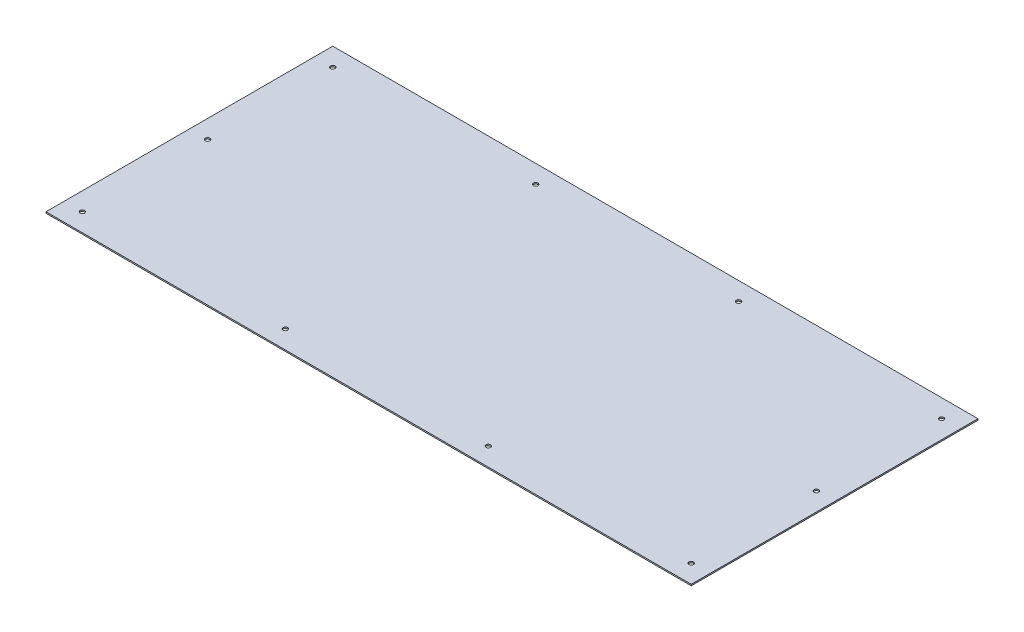
ISO-10303-21;
HEADER;
FILE_DESCRIPTION(('STEP AP214'),'2;1');
FILE_NAME('part.step','',(''),(''),'','','');
FILE_SCHEMA(('AUTOMOTIVE_DESIGN { 1 0 10303 214 1 1 1 1 }'));
ENDSEC;
DATA;
#1=APPLICATION_CONTEXT('core data for automotive mechanical design processes');
#2=APPLICATION_PROTOCOL_DEFINITION('international standard','automotive_design',2000,#1);
#3=PRODUCT_CONTEXT('',#1,'mechanical');
#4=PRODUCT('Part','Part','',(#3));
#5=PRODUCT_RELATED_PRODUCT_CATEGORY('part','',(#4));
#6=PRODUCT_DEFINITION_FORMATION('','',#4);
#7=PRODUCT_DEFINITION_CONTEXT('part definition',#1,'design');
#8=PRODUCT_DEFINITION('design','',#6,#7);
#9=PRODUCT_DEFINITION_SHAPE('','',#8);
#10=(LENGTH_UNIT() NAMED_UNIT(*) SI_UNIT(.MILLI.,.METRE.));
#11=(NAMED_UNIT(*) PLANE_ANGLE_UNIT() SI_UNIT($,.RADIAN.));
#12=(NAMED_UNIT(*) SI_UNIT($,.STERADIAN.) SOLID_ANGLE_UNIT());
#13=UNCERTAINTY_MEASURE_WITH_UNIT(LENGTH_MEASURE(1.E-05),#10,'distance_accuracy_value','');
#14=(GEOMETRIC_REPRESENTATION_CONTEXT(3) GLOBAL_UNCERTAINTY_ASSIGNED_CONTEXT((#13)) GLOBAL_UNIT_ASSIGNED_CONTEXT((#10,
#11,#12)) REPRESENTATION_CONTEXT('',''));
#15=CARTESIAN_POINT('',(0.,0.,0.));
#16=DIRECTION('',(0.,0.,1.));
#17=DIRECTION('',(1.,0.,0.));
#18=AXIS2_PLACEMENT_3D('',#15,#16,#17);
#19=CARTESIAN_POINT('',(450.,1.9,-200.));
#20=DIRECTION('',(-1.,0.,0.));
#21=DIRECTION('',(0.,0.,1.));
#22=AXIS2_PLACEMENT_3D('',#19,#20,#21);
#23=PLANE('',#22);
#24=DIRECTION('',(0.,0.,-1.));
#25=VECTOR('',#24,1.);
#26=CARTESIAN_POINT('',(450.,0.,-200.));
#27=LINE('',#26,#25);
#28=CARTESIAN_POINT('',(450.,0.,200.));
#29=VERTEX_POINT('',#28);
#30=CARTESIAN_POINT('',(450.,0.,-200.));
#31=VERTEX_POINT('',#30);
#32=EDGE_CURVE('E104',#29,#31,#27,.T.);
#33=ORIENTED_EDGE('',*,*,#32,.T.);
#34=DIRECTION('',(0.,-1.,0.));
#35=VECTOR('',#34,1.);
#36=CARTESIAN_POINT('',(450.,1.9,-200.));
#37=LINE('',#36,#35);
#38=CARTESIAN_POINT('',(450.,1.9,-200.));
#39=VERTEX_POINT('',#38);
#40=EDGE_CURVE('E11',#39,#31,#37,.T.);
#41=ORIENTED_EDGE('',*,*,#40,.F.);
#42=DIRECTION('',(0.,0.,-1.));
#43=VECTOR('',#42,1.);
#44=CARTESIAN_POINT('',(450.,1.9,-200.));
#45=LINE('',#44,#43);
#46=CARTESIAN_POINT('',(450.,1.9,200.));
#47=VERTEX_POINT('',#46);
#48=EDGE_CURVE('E91',#47,#39,#45,.T.);
#49=ORIENTED_EDGE('',*,*,#48,.F.);
#50=DIRECTION('',(0.,-1.,0.));
#51=VECTOR('',#50,1.);
#52=CARTESIAN_POINT('',(450.,1.9,200.));
#53=LINE('',#52,#51);
#54=EDGE_CURVE('E100',#47,#29,#53,.T.);
#55=ORIENTED_EDGE('',*,*,#54,.T.);
#56=EDGE_LOOP('',(#33,#41,#49,#55));
#57=FACE_BOUND('',#56,.T.);
#58=ADVANCED_FACE('F38',(#57),#23,.F.);
#59=CARTESIAN_POINT('',(-450.,1.9,-200.));
#60=DIRECTION('',(0.,0.,1.));
#61=DIRECTION('',(1.,0.,0.));
#62=AXIS2_PLACEMENT_3D('',#59,#60,#61);
#63=PLANE('',#62);
#64=DIRECTION('',(-1.,0.,0.));
#65=VECTOR('',#64,1.);
#66=CARTESIAN_POINT('',(-450.,0.,-200.));
#67=LINE('',#66,#65);
#68=CARTESIAN_POINT('',(-450.,0.,-200.));
#69=VERTEX_POINT('',#68);
#70=EDGE_CURVE('E95',#31,#69,#67,.T.);
#71=ORIENTED_EDGE('',*,*,#70,.T.);
#72=DIRECTION('',(0.,-1.,0.));
#73=VECTOR('',#72,1.);
#74=CARTESIAN_POINT('',(-450.,1.9,-200.));
#75=LINE('',#74,#73);
#76=CARTESIAN_POINT('',(-450.,1.9,-200.));
#77=VERTEX_POINT('',#76);
#78=EDGE_CURVE('E47',#77,#69,#75,.T.);
#79=ORIENTED_EDGE('',*,*,#78,.F.);
#80=DIRECTION('',(-1.,0.,0.));
#81=VECTOR('',#80,1.);
#82=CARTESIAN_POINT('',(-450.,1.9,-200.));
#83=LINE('',#82,#81);
#84=EDGE_CURVE('E86',#39,#77,#83,.T.);
#85=ORIENTED_EDGE('',*,*,#84,.F.);
#86=ORIENTED_EDGE('',*,*,#40,.T.);
#87=EDGE_LOOP('',(#71,#79,#85,#86));
#88=FACE_BOUND('',#87,.T.);
#89=ADVANCED_FACE('F94',(#88),#63,.F.);
#90=CARTESIAN_POINT('',(-450.,1.9,-200.));
#91=DIRECTION('',(1.,0.,0.));
#92=DIRECTION('',(0.,0.,-1.));
#93=AXIS2_PLACEMENT_3D('',#90,#91,#92);
#94=PLANE('',#93);
#95=DIRECTION('',(0.,0.,1.));
#96=VECTOR('',#95,1.);
#97=CARTESIAN_POINT('',(-450.,0.,-200.));
#98=LINE('',#97,#96);
#99=CARTESIAN_POINT('',(-450.,0.,200.));
#100=VERTEX_POINT('',#99);
#101=EDGE_CURVE('E73',#69,#100,#98,.T.);
#102=ORIENTED_EDGE('',*,*,#101,.T.);
#103=DIRECTION('',(0.,-1.,0.));
#104=VECTOR('',#103,1.);
#105=CARTESIAN_POINT('',(-450.,1.9,200.));
#106=LINE('',#105,#104);
#107=CARTESIAN_POINT('',(-450.,1.9,200.));
#108=VERTEX_POINT('',#107);
#109=EDGE_CURVE('E96',#108,#100,#106,.T.);
#110=ORIENTED_EDGE('',*,*,#109,.F.);
#111=DIRECTION('',(0.,0.,1.));
#112=VECTOR('',#111,1.);
#113=CARTESIAN_POINT('',(-450.,1.9,-200.));
#114=LINE('',#113,#112);
#115=EDGE_CURVE('E89',#77,#108,#114,.T.);
#116=ORIENTED_EDGE('',*,*,#115,.F.);
#117=ORIENTED_EDGE('',*,*,#78,.T.);
#118=EDGE_LOOP('',(#102,#110,#116,#117));
#119=FACE_BOUND('',#118,.T.);
#120=ADVANCED_FACE('F98',(#119),#94,.F.);
#121=CARTESIAN_POINT('',(-450.,1.9,200.));
#122=DIRECTION('',(0.,0.,-1.));
#123=DIRECTION('',(-1.,0.,0.));
#124=AXIS2_PLACEMENT_3D('',#121,#122,#123);
#125=PLANE('',#124);
#126=DIRECTION('',(1.,0.,0.));
#127=VECTOR('',#126,1.);
#128=CARTESIAN_POINT('',(-450.,0.,200.));
#129=LINE('',#128,#127);
#130=EDGE_CURVE('E79',#100,#29,#129,.T.);
#131=ORIENTED_EDGE('',*,*,#130,.T.);
#132=ORIENTED_EDGE('',*,*,#54,.F.);
#133=DIRECTION('',(1.,0.,0.));
#134=VECTOR('',#133,1.);
#135=CARTESIAN_POINT('',(-450.,1.9,200.));
#136=LINE('',#135,#134);
#137=EDGE_CURVE('E56',#108,#47,#136,.T.);
#138=ORIENTED_EDGE('',*,*,#137,.F.);
#139=ORIENTED_EDGE('',*,*,#109,.T.);
#140=EDGE_LOOP('',(#131,#132,#138,#139));
#141=FACE_BOUND('',#140,.T.);
#142=ADVANCED_FACE('F182',(#141),#125,.F.);
#143=CARTESIAN_POINT('',(0.,1.9,0.));
#144=DIRECTION('',(0.,1.,0.));
#145=DIRECTION('',(0.,0.,1.));
#146=AXIS2_PLACEMENT_3D('',#143,#144,#145);
#147=PLANE('',#146);
#148=CARTESIAN_POINT('',(424.6,1.9,174.6));
#149=DIRECTION('',(0.,1.,0.));
#150=DIRECTION('',(0.,0.,-1.));
#151=AXIS2_PLACEMENT_3D('',#148,#149,#150);
#152=CIRCLE('',#151,3.17499999999997);
#153=CARTESIAN_POINT('',(424.6,1.9,171.425));
#154=VERTEX_POINT('',#153);
#155=EDGE_CURVE('E153',#154,#154,#152,.T.);
#156=ORIENTED_EDGE('',*,*,#155,.F.);
#157=EDGE_LOOP('',(#156));
#158=FACE_BOUND('',#157,.T.);
#159=CARTESIAN_POINT('',(-141.54,1.9,174.6));
#160=DIRECTION('',(0.,1.,0.));
#161=DIRECTION('',(0.,0.,1.));
#162=AXIS2_PLACEMENT_3D('',#159,#160,#161);
#163=CIRCLE('',#162,3.17499999999997);
#164=CARTESIAN_POINT('',(-141.54,1.9,177.775));
#165=VERTEX_POINT('',#164);
#166=EDGE_CURVE('E161',#165,#165,#163,.T.);
#167=ORIENTED_EDGE('',*,*,#166,.F.);
#168=EDGE_LOOP('',(#167));
#169=FACE_BOUND('',#168,.T.);
#170=CARTESIAN_POINT('',(141.52,1.9,174.6));
#171=DIRECTION('',(0.,1.,0.));
#172=DIRECTION('',(0.,0.,1.));
#173=AXIS2_PLACEMENT_3D('',#170,#171,#172);
#174=CIRCLE('',#173,3.17499999999997);
#175=CARTESIAN_POINT('',(141.52,1.9,177.775));
#176=VERTEX_POINT('',#175);
#177=EDGE_CURVE('E164',#176,#176,#174,.T.);
#178=ORIENTED_EDGE('',*,*,#177,.F.);
#179=EDGE_LOOP('',(#178));
#180=FACE_BOUND('',#179,.T.);
#181=CARTESIAN_POINT('',(141.52,1.9,-174.6));
#182=DIRECTION('',(0.,1.,0.));
#183=DIRECTION('',(0.,0.,-1.));
#184=AXIS2_PLACEMENT_3D('',#181,#182,#183);
#185=CIRCLE('',#184,3.17499999999997);
#186=CARTESIAN_POINT('',(141.52,1.9,-177.775));
#187=VERTEX_POINT('',#186);
#188=EDGE_CURVE('E170',#187,#187,#185,.T.);
#189=ORIENTED_EDGE('',*,*,#188,.F.);
#190=EDGE_LOOP('',(#189));
#191=FACE_BOUND('',#190,.T.);
#192=CARTESIAN_POINT('',(-141.54,1.9,-174.6));
#193=DIRECTION('',(0.,1.,0.));
#194=DIRECTION('',(0.,0.,-1.));
#195=AXIS2_PLACEMENT_3D('',#192,#193,#194);
#196=CIRCLE('',#195,3.17499999999997);
#197=CARTESIAN_POINT('',(-141.54,1.9,-177.775));
#198=VERTEX_POINT('',#197);
#199=EDGE_CURVE('E167',#198,#198,#196,.T.);
#200=ORIENTED_EDGE('',*,*,#199,.F.);
#201=EDGE_LOOP('',(#200));
#202=FACE_BOUND('',#201,.T.);
#203=CARTESIAN_POINT('',(424.6,1.9,0.));
#204=DIRECTION('',(0.,1.,0.));
#205=DIRECTION('',(0.,0.,-1.));
#206=AXIS2_PLACEMENT_3D('',#203,#204,#205);
#207=CIRCLE('',#206,3.17499999999997);
#208=CARTESIAN_POINT('',(424.6,1.9,-3.17499999999997));
#209=VERTEX_POINT('',#208);
#210=EDGE_CURVE('E149',#209,#209,#207,.T.);
#211=ORIENTED_EDGE('',*,*,#210,.F.);
#212=EDGE_LOOP('',(#211));
#213=FACE_BOUND('',#212,.T.);
#214=CARTESIAN_POINT('',(424.6,1.9,-174.6));
#215=DIRECTION('',(0.,1.,0.));
#216=DIRECTION('',(0.,0.,-1.));
#217=AXIS2_PLACEMENT_3D('',#214,#215,#216);
#218=CIRCLE('',#217,3.17499999999997);
#219=CARTESIAN_POINT('',(424.6,1.9,-177.775));
#220=VERTEX_POINT('',#219);
#221=EDGE_CURVE('E152',#220,#220,#218,.T.);
#222=ORIENTED_EDGE('',*,*,#221,.F.);
#223=EDGE_LOOP('',(#222));
#224=FACE_BOUND('',#223,.T.);
#225=CARTESIAN_POINT('',(-424.6,1.9,0.));
#226=DIRECTION('',(0.,1.,0.));
#227=DIRECTION('',(0.,0.,1.));
#228=AXIS2_PLACEMENT_3D('',#225,#226,#227);
#229=CIRCLE('',#228,3.17499999999997);
#230=CARTESIAN_POINT('',(-424.6,1.9,3.17499999999997));
#231=VERTEX_POINT('',#230);
#232=EDGE_CURVE('E156',#231,#231,#229,.T.);
#233=ORIENTED_EDGE('',*,*,#232,.F.);
#234=EDGE_LOOP('',(#233));
#235=FACE_BOUND('',#234,.T.);
#236=CARTESIAN_POINT('',(-424.6,1.9,-174.6));
#237=DIRECTION('',(0.,1.,0.));
#238=DIRECTION('',(0.,0.,1.));
#239=AXIS2_PLACEMENT_3D('',#236,#237,#238);
#240=CIRCLE('',#239,3.17499999999997);
#241=CARTESIAN_POINT('',(-424.6,1.9,-171.425));
#242=VERTEX_POINT('',#241);
#243=EDGE_CURVE('E120',#242,#242,#240,.T.);
#244=ORIENTED_EDGE('',*,*,#243,.F.);
#245=EDGE_LOOP('',(#244));
#246=FACE_BOUND('',#245,.T.);
#247=CARTESIAN_POINT('',(-424.6,1.9,174.6));
#248=DIRECTION('',(0.,1.,0.));
#249=DIRECTION('',(0.,0.,1.));
#250=AXIS2_PLACEMENT_3D('',#247,#248,#249);
#251=CIRCLE('',#250,3.17499999999997);
#252=CARTESIAN_POINT('',(-424.6,1.9,177.775));
#253=VERTEX_POINT('',#252);
#254=EDGE_CURVE('E115',#253,#253,#251,.T.);
#255=ORIENTED_EDGE('',*,*,#254,.F.);
#256=EDGE_LOOP('',(#255));
#257=FACE_BOUND('',#256,.T.);
#258=ORIENTED_EDGE('',*,*,#48,.T.);
#259=ORIENTED_EDGE('',*,*,#84,.T.);
#260=ORIENTED_EDGE('',*,*,#115,.T.);
#261=ORIENTED_EDGE('',*,*,#137,.T.);
#262=EDGE_LOOP('',(#258,#259,#260,#261));
#263=FACE_BOUND('',#262,.T.);
#264=ADVANCED_FACE('F87',(#158,#169,#180,#191,#202,#213,#224,#235,#246,#257,#263),#147,.T.);
#265=CARTESIAN_POINT('',(0.,0.,0.));
#266=DIRECTION('',(0.,1.,0.));
#267=DIRECTION('',(0.,0.,1.));
#268=AXIS2_PLACEMENT_3D('',#265,#266,#267);
#269=PLANE('',#268);
#270=CARTESIAN_POINT('',(424.6,0.,174.6));
#271=DIRECTION('',(0.,1.,0.));
#272=DIRECTION('',(0.,0.,1.));
#273=AXIS2_PLACEMENT_3D('',#270,#271,#272);
#274=CIRCLE('',#273,3.17499999999997);
#275=CARTESIAN_POINT('',(424.6,0.,177.775));
#276=VERTEX_POINT('',#275);
#277=EDGE_CURVE('E41',#276,#276,#274,.T.);
#278=ORIENTED_EDGE('',*,*,#277,.T.);
#279=EDGE_LOOP('',(#278));
#280=FACE_BOUND('',#279,.T.);
#281=CARTESIAN_POINT('',(-141.54,0.,174.6));
#282=DIRECTION('',(0.,1.,0.));
#283=DIRECTION('',(0.,0.,1.));
#284=AXIS2_PLACEMENT_3D('',#281,#282,#283);
#285=CIRCLE('',#284,3.17499999999997);
#286=CARTESIAN_POINT('',(-141.54,0.,177.775));
#287=VERTEX_POINT('',#286);
#288=EDGE_CURVE('E137',#287,#287,#285,.T.);
#289=ORIENTED_EDGE('',*,*,#288,.T.);
#290=EDGE_LOOP('',(#289));
#291=FACE_BOUND('',#290,.T.);
#292=CARTESIAN_POINT('',(141.52,0.,174.6));
#293=DIRECTION('',(0.,1.,0.));
#294=DIRECTION('',(0.,0.,1.));
#295=AXIS2_PLACEMENT_3D('',#292,#293,#294);
#296=CIRCLE('',#295,3.17499999999997);
#297=CARTESIAN_POINT('',(141.52,0.,177.775));
#298=VERTEX_POINT('',#297);
#299=EDGE_CURVE('E135',#298,#298,#296,.T.);
#300=ORIENTED_EDGE('',*,*,#299,.T.);
#301=EDGE_LOOP('',(#300));
#302=FACE_BOUND('',#301,.T.);
#303=CARTESIAN_POINT('',(141.52,0.,-174.6));
#304=DIRECTION('',(0.,1.,0.));
#305=DIRECTION('',(0.,0.,1.));
#306=AXIS2_PLACEMENT_3D('',#303,#304,#305);
#307=CIRCLE('',#306,3.17499999999997);
#308=CARTESIAN_POINT('',(141.52,0.,-171.425));
#309=VERTEX_POINT('',#308);
#310=EDGE_CURVE('E132',#309,#309,#307,.T.);
#311=ORIENTED_EDGE('',*,*,#310,.T.);
#312=EDGE_LOOP('',(#311));
#313=FACE_BOUND('',#312,.T.);
#314=CARTESIAN_POINT('',(-141.54,0.,-174.6));
#315=DIRECTION('',(0.,1.,0.));
#316=DIRECTION('',(0.,0.,1.));
#317=AXIS2_PLACEMENT_3D('',#314,#315,#316);
#318=CIRCLE('',#317,3.17499999999997);
#319=CARTESIAN_POINT('',(-141.54,0.,-171.425));
#320=VERTEX_POINT('',#319);
#321=EDGE_CURVE('E129',#320,#320,#318,.T.);
#322=ORIENTED_EDGE('',*,*,#321,.T.);
#323=EDGE_LOOP('',(#322));
#324=FACE_BOUND('',#323,.T.);
#325=CARTESIAN_POINT('',(424.6,0.,0.));
#326=DIRECTION('',(0.,1.,0.));
#327=DIRECTION('',(0.,0.,1.));
#328=AXIS2_PLACEMENT_3D('',#325,#326,#327);
#329=CIRCLE('',#328,3.17499999999997);
#330=CARTESIAN_POINT('',(424.6,0.,3.17499999999997));
#331=VERTEX_POINT('',#330);
#332=EDGE_CURVE('E126',#331,#331,#329,.T.);
#333=ORIENTED_EDGE('',*,*,#332,.T.);
#334=EDGE_LOOP('',(#333));
#335=FACE_BOUND('',#334,.T.);
#336=CARTESIAN_POINT('',(424.6,0.,-174.6));
#337=DIRECTION('',(0.,1.,0.));
#338=DIRECTION('',(0.,0.,1.));
#339=AXIS2_PLACEMENT_3D('',#336,#337,#338);
#340=CIRCLE('',#339,3.17499999999997);
#341=CARTESIAN_POINT('',(424.6,0.,-171.425));
#342=VERTEX_POINT('',#341);
#343=EDGE_CURVE('E123',#342,#342,#340,.T.);
#344=ORIENTED_EDGE('',*,*,#343,.T.);
#345=EDGE_LOOP('',(#344));
#346=FACE_BOUND('',#345,.T.);
#347=CARTESIAN_POINT('',(-424.6,0.,0.));
#348=DIRECTION('',(0.,1.,0.));
#349=DIRECTION('',(0.,0.,1.));
#350=AXIS2_PLACEMENT_3D('',#347,#348,#349);
#351=CIRCLE('',#350,3.17499999999997);
#352=CARTESIAN_POINT('',(-424.6,0.,3.17499999999997));
#353=VERTEX_POINT('',#352);
#354=EDGE_CURVE('E119',#353,#353,#351,.T.);
#355=ORIENTED_EDGE('',*,*,#354,.T.);
#356=EDGE_LOOP('',(#355));
#357=FACE_BOUND('',#356,.T.);
#358=CARTESIAN_POINT('',(-424.6,0.,-174.6));
#359=DIRECTION('',(0.,1.,0.));
#360=DIRECTION('',(0.,0.,1.));
#361=AXIS2_PLACEMENT_3D('',#358,#359,#360);
#362=CIRCLE('',#361,3.17499999999997);
#363=CARTESIAN_POINT('',(-424.6,0.,-171.425));
#364=VERTEX_POINT('',#363);
#365=EDGE_CURVE('E116',#364,#364,#362,.T.);
#366=ORIENTED_EDGE('',*,*,#365,.T.);
#367=EDGE_LOOP('',(#366));
#368=FACE_BOUND('',#367,.T.);
#369=CARTESIAN_POINT('',(-424.6,0.,174.6));
#370=DIRECTION('',(0.,1.,0.));
#371=DIRECTION('',(0.,0.,1.));
#372=AXIS2_PLACEMENT_3D('',#369,#370,#371);
#373=CIRCLE('',#372,3.17499999999997);
#374=CARTESIAN_POINT('',(-424.6,0.,177.775));
#375=VERTEX_POINT('',#374);
#376=EDGE_CURVE('E107',#375,#375,#373,.T.);
#377=ORIENTED_EDGE('',*,*,#376,.T.);
#378=EDGE_LOOP('',(#377));
#379=FACE_BOUND('',#378,.T.);
#380=ORIENTED_EDGE('',*,*,#32,.F.);
#381=ORIENTED_EDGE('',*,*,#130,.F.);
#382=ORIENTED_EDGE('',*,*,#101,.F.);
#383=ORIENTED_EDGE('',*,*,#70,.F.);
#384=EDGE_LOOP('',(#380,#381,#382,#383));
#385=FACE_BOUND('',#384,.T.);
#386=ADVANCED_FACE('F181',(#280,#291,#302,#313,#324,#335,#346,#357,#368,#379,#385),#269,.F.);
#387=CARTESIAN_POINT('',(-424.6,-8.1,174.6));
#388=DIRECTION('',(0.,1.,0.));
#389=DIRECTION('',(0.,0.,1.));
#390=AXIS2_PLACEMENT_3D('',#387,#388,#389);
#391=CYLINDRICAL_SURFACE('',#390,3.17499999999997);
#392=ORIENTED_EDGE('',*,*,#254,.T.);
#393=EDGE_LOOP('',(#392));
#394=FACE_BOUND('',#393,.T.);
#395=ORIENTED_EDGE('',*,*,#376,.F.);
#396=EDGE_LOOP('',(#395));
#397=FACE_BOUND('',#396,.T.);
#398=ADVANCED_FACE('F202',(#394,#397),#391,.F.);
#399=CARTESIAN_POINT('',(-424.6,-8.1,-174.6));
#400=DIRECTION('',(0.,1.,0.));
#401=DIRECTION('',(0.,0.,1.));
#402=AXIS2_PLACEMENT_3D('',#399,#400,#401);
#403=CYLINDRICAL_SURFACE('',#402,3.17499999999997);
#404=ORIENTED_EDGE('',*,*,#243,.T.);
#405=EDGE_LOOP('',(#404));
#406=FACE_BOUND('',#405,.T.);
#407=ORIENTED_EDGE('',*,*,#365,.F.);
#408=EDGE_LOOP('',(#407));
#409=FACE_BOUND('',#408,.T.);
#410=ADVANCED_FACE('F198',(#406,#409),#403,.F.);
#411=CARTESIAN_POINT('',(-424.6,-8.1,0.));
#412=DIRECTION('',(0.,1.,0.));
#413=DIRECTION('',(0.,0.,1.));
#414=AXIS2_PLACEMENT_3D('',#411,#412,#413);
#415=CYLINDRICAL_SURFACE('',#414,3.17499999999997);
#416=ORIENTED_EDGE('',*,*,#232,.T.);
#417=EDGE_LOOP('',(#416));
#418=FACE_BOUND('',#417,.T.);
#419=ORIENTED_EDGE('',*,*,#354,.F.);
#420=EDGE_LOOP('',(#419));
#421=FACE_BOUND('',#420,.T.);
#422=ADVANCED_FACE('F201',(#418,#421),#415,.F.);
#423=CARTESIAN_POINT('',(424.6,-8.1,-174.6));
#424=DIRECTION('',(0.,1.,0.));
#425=DIRECTION('',(0.,0.,1.));
#426=AXIS2_PLACEMENT_3D('',#423,#424,#425);
#427=CYLINDRICAL_SURFACE('',#426,3.17499999999997);
#428=ORIENTED_EDGE('',*,*,#221,.T.);
#429=EDGE_LOOP('',(#428));
#430=FACE_BOUND('',#429,.T.);
#431=ORIENTED_EDGE('',*,*,#343,.F.);
#432=EDGE_LOOP('',(#431));
#433=FACE_BOUND('',#432,.T.);
#434=ADVANCED_FACE('F270',(#430,#433),#427,.F.);
#435=CARTESIAN_POINT('',(424.6,-8.1,0.));
#436=DIRECTION('',(0.,1.,0.));
#437=DIRECTION('',(0.,0.,1.));
#438=AXIS2_PLACEMENT_3D('',#435,#436,#437);
#439=CYLINDRICAL_SURFACE('',#438,3.17499999999997);
#440=ORIENTED_EDGE('',*,*,#210,.T.);
#441=EDGE_LOOP('',(#440));
#442=FACE_BOUND('',#441,.T.);
#443=ORIENTED_EDGE('',*,*,#332,.F.);
#444=EDGE_LOOP('',(#443));
#445=FACE_BOUND('',#444,.T.);
#446=ADVANCED_FACE('F280',(#442,#445),#439,.F.);
#447=CARTESIAN_POINT('',(-141.54,-8.1,-174.6));
#448=DIRECTION('',(0.,1.,0.));
#449=DIRECTION('',(0.,0.,1.));
#450=AXIS2_PLACEMENT_3D('',#447,#448,#449);
#451=CYLINDRICAL_SURFACE('',#450,3.17499999999997);
#452=ORIENTED_EDGE('',*,*,#199,.T.);
#453=EDGE_LOOP('',(#452));
#454=FACE_BOUND('',#453,.T.);
#455=ORIENTED_EDGE('',*,*,#321,.F.);
#456=EDGE_LOOP('',(#455));
#457=FACE_BOUND('',#456,.T.);
#458=ADVANCED_FACE('F290',(#454,#457),#451,.F.);
#459=CARTESIAN_POINT('',(141.52,-8.1,-174.6));
#460=DIRECTION('',(0.,1.,0.));
#461=DIRECTION('',(0.,0.,1.));
#462=AXIS2_PLACEMENT_3D('',#459,#460,#461);
#463=CYLINDRICAL_SURFACE('',#462,3.17499999999997);
#464=ORIENTED_EDGE('',*,*,#188,.T.);
#465=EDGE_LOOP('',(#464));
#466=FACE_BOUND('',#465,.T.);
#467=ORIENTED_EDGE('',*,*,#310,.F.);
#468=EDGE_LOOP('',(#467));
#469=FACE_BOUND('',#468,.T.);
#470=ADVANCED_FACE('F300',(#466,#469),#463,.F.);
#471=CARTESIAN_POINT('',(141.52,-8.1,174.6));
#472=DIRECTION('',(0.,1.,0.));
#473=DIRECTION('',(0.,0.,1.));
#474=AXIS2_PLACEMENT_3D('',#471,#472,#473);
#475=CYLINDRICAL_SURFACE('',#474,3.17499999999997);
#476=ORIENTED_EDGE('',*,*,#177,.T.);
#477=EDGE_LOOP('',(#476));
#478=FACE_BOUND('',#477,.T.);
#479=ORIENTED_EDGE('',*,*,#299,.F.);
#480=EDGE_LOOP('',(#479));
#481=FACE_BOUND('',#480,.T.);
#482=ADVANCED_FACE('F176',(#478,#481),#475,.F.);
#483=CARTESIAN_POINT('',(-141.54,-8.1,174.6));
#484=DIRECTION('',(0.,1.,0.));
#485=DIRECTION('',(0.,0.,1.));
#486=AXIS2_PLACEMENT_3D('',#483,#484,#485);
#487=CYLINDRICAL_SURFACE('',#486,3.17499999999997);
#488=ORIENTED_EDGE('',*,*,#166,.T.);
#489=EDGE_LOOP('',(#488));
#490=FACE_BOUND('',#489,.T.);
#491=ORIENTED_EDGE('',*,*,#288,.F.);
#492=EDGE_LOOP('',(#491));
#493=FACE_BOUND('',#492,.T.);
#494=ADVANCED_FACE('F319',(#490,#493),#487,.F.);
#495=CARTESIAN_POINT('',(424.6,-8.1,174.6));
#496=DIRECTION('',(0.,1.,0.));
#497=DIRECTION('',(0.,0.,1.));
#498=AXIS2_PLACEMENT_3D('',#495,#496,#497);
#499=CYLINDRICAL_SURFACE('',#498,3.17499999999997);
#500=ORIENTED_EDGE('',*,*,#155,.T.);
#501=EDGE_LOOP('',(#500));
#502=FACE_BOUND('',#501,.T.);
#503=ORIENTED_EDGE('',*,*,#277,.F.);
#504=EDGE_LOOP('',(#503));
#505=FACE_BOUND('',#504,.T.);
#506=ADVANCED_FACE('F328',(#502,#505),#499,.F.);
#507=CLOSED_SHELL('',(#58,#89,#120,#142,#264,#386,#398,#410,#422,#434,#446,#458,#470,#482,#494,#506));
#508=MANIFOLD_SOLID_BREP('B2',#507);
#509=ADVANCED_BREP_SHAPE_REPRESENTATION('',(#18,#508),#14);
#510=SHAPE_DEFINITION_REPRESENTATION(#9,#509);
ENDSEC;
END-ISO-10303-21;
